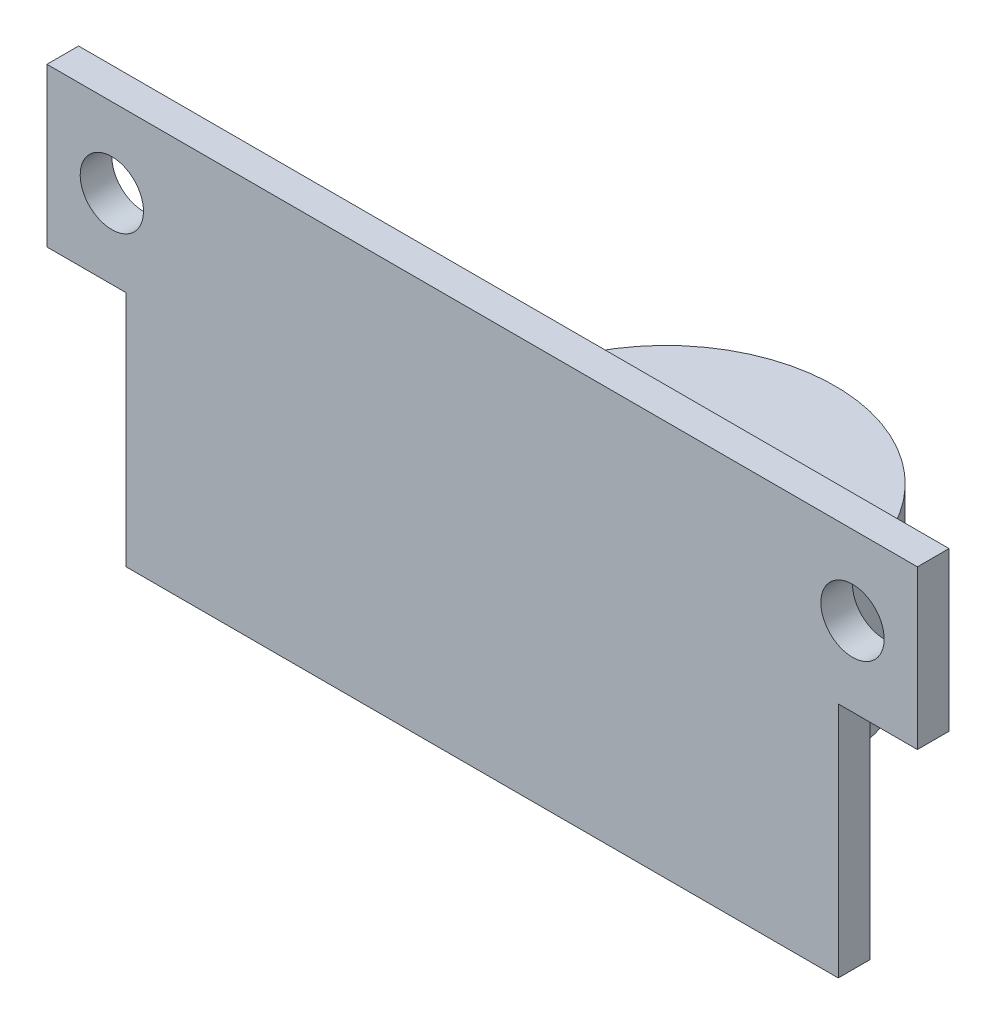
ISO-10303-21;
HEADER;
FILE_DESCRIPTION(('STEP AP214'),'2;1');
FILE_NAME('part.step','',(''),(''),'','','');
FILE_SCHEMA(('AUTOMOTIVE_DESIGN { 1 0 10303 214 1 1 1 1 }'));
ENDSEC;
DATA;
#1=APPLICATION_CONTEXT('core data for automotive mechanical design processes');
#2=APPLICATION_PROTOCOL_DEFINITION('international standard','automotive_design',2000,#1);
#3=PRODUCT_CONTEXT('',#1,'mechanical');
#4=PRODUCT('Part','Part','',(#3));
#5=PRODUCT_RELATED_PRODUCT_CATEGORY('part','',(#4));
#6=PRODUCT_DEFINITION_FORMATION('','',#4);
#7=PRODUCT_DEFINITION_CONTEXT('part definition',#1,'design');
#8=PRODUCT_DEFINITION('design','',#6,#7);
#9=PRODUCT_DEFINITION_SHAPE('','',#8);
#10=(LENGTH_UNIT() NAMED_UNIT(*) SI_UNIT(.MILLI.,.METRE.));
#11=(NAMED_UNIT(*) PLANE_ANGLE_UNIT() SI_UNIT($,.RADIAN.));
#12=(NAMED_UNIT(*) SI_UNIT($,.STERADIAN.) SOLID_ANGLE_UNIT());
#13=UNCERTAINTY_MEASURE_WITH_UNIT(LENGTH_MEASURE(1.E-05),#10,'distance_accuracy_value','');
#14=(GEOMETRIC_REPRESENTATION_CONTEXT(3) GLOBAL_UNCERTAINTY_ASSIGNED_CONTEXT((#13)) GLOBAL_UNIT_ASSIGNED_CONTEXT((#10,
#11,#12)) REPRESENTATION_CONTEXT('',''));
#15=CARTESIAN_POINT('',(0.,0.,0.));
#16=DIRECTION('',(0.,0.,1.));
#17=DIRECTION('',(1.,0.,0.));
#18=AXIS2_PLACEMENT_3D('',#15,#16,#17);
#19=CARTESIAN_POINT('',(0.,0.,3.99999999999998));
#20=DIRECTION('',(0.,0.,-1.));
#21=DIRECTION('',(0.,1.,0.));
#22=AXIS2_PLACEMENT_3D('',#19,#20,#21);
#23=PLANE('',#22);
#24=DIRECTION('',(0.,1.,0.));
#25=VECTOR('',#24,1.);
#26=CARTESIAN_POINT('',(4.30657205279038,0.,3.99999999999998));
#27=LINE('',#26,#25);
#28=CARTESIAN_POINT('',(4.30657205279038,-25.,3.99999999999997));
#29=VERTEX_POINT('',#28);
#30=CARTESIAN_POINT('',(4.30657205279038,-15.,3.99999999999997));
#31=VERTEX_POINT('',#30);
#32=EDGE_CURVE('E290',#29,#31,#27,.T.);
#33=ORIENTED_EDGE('',*,*,#32,.F.);
#34=DIRECTION('',(-1.,0.,0.));
#35=VECTOR('',#34,1.);
#36=CARTESIAN_POINT('',(13.9916828962797,-25.,3.99999999999997));
#37=LINE('',#36,#35);
#38=CARTESIAN_POINT('',(-7.49342794721088,-25.,3.99999999999996));
#39=VERTEX_POINT('',#38);
#40=EDGE_CURVE('E185',#29,#39,#37,.T.);
#41=ORIENTED_EDGE('',*,*,#40,.T.);
#42=DIRECTION('',(0.,-1.,0.));
#43=VECTOR('',#42,1.);
#44=CARTESIAN_POINT('',(-7.49342794721085,-132.522193308764,3.99999999999992));
#45=LINE('',#44,#43);
#46=CARTESIAN_POINT('',(-7.49342794721088,-10.,3.99999999999997));
#47=VERTEX_POINT('',#46);
#48=EDGE_CURVE('E204',#47,#39,#45,.T.);
#49=ORIENTED_EDGE('',*,*,#48,.F.);
#50=DIRECTION('',(-1.,0.,0.));
#51=VECTOR('',#50,1.);
#52=CARTESIAN_POINT('',(13.9916828962796,-9.99999999999999,3.99999999999997));
#53=LINE('',#52,#51);
#54=CARTESIAN_POINT('',(-12.493427947211,-10.,3.99999999999997));
#55=VERTEX_POINT('',#54);
#56=EDGE_CURVE('E229',#47,#55,#53,.T.);
#57=ORIENTED_EDGE('',*,*,#56,.T.);
#58=DIRECTION('',(0.,1.,0.));
#59=VECTOR('',#58,1.);
#60=CARTESIAN_POINT('',(-12.4934279472109,-132.522193308764,3.99999999999992));
#61=LINE('',#60,#59);
#62=CARTESIAN_POINT('',(-12.493427947211,0.,3.99999999999997));
#63=VERTEX_POINT('',#62);
#64=EDGE_CURVE('E153',#55,#63,#61,.T.);
#65=ORIENTED_EDGE('',*,*,#64,.T.);
#66=DIRECTION('',(-1.,0.,0.));
#67=VECTOR('',#66,1.);
#68=CARTESIAN_POINT('',(13.9916828962797,0.,3.99999999999998));
#69=LINE('',#68,#67);
#70=CARTESIAN_POINT('',(42.5065720527891,0.,3.99999999999998));
#71=VERTEX_POINT('',#70);
#72=EDGE_CURVE('E260',#71,#63,#69,.T.);
#73=ORIENTED_EDGE('',*,*,#72,.F.);
#74=DIRECTION('',(0.,1.,0.));
#75=VECTOR('',#74,1.);
#76=CARTESIAN_POINT('',(42.5065720527891,-132.522193308764,3.99999999999993));
#77=LINE('',#76,#75);
#78=CARTESIAN_POINT('',(42.5065720527891,-9.99999999999997,3.99999999999998));
#79=VERTEX_POINT('',#78);
#80=EDGE_CURVE('E255',#79,#71,#77,.T.);
#81=ORIENTED_EDGE('',*,*,#80,.F.);
#82=DIRECTION('',(-1.,0.,0.));
#83=VECTOR('',#82,1.);
#84=CARTESIAN_POINT('',(13.9916828962796,-9.99999999999999,3.99999999999997));
#85=LINE('',#84,#83);
#86=CARTESIAN_POINT('',(37.5065720527891,-9.99999999999998,3.99999999999998));
#87=VERTEX_POINT('',#86);
#88=EDGE_CURVE('E181',#79,#87,#85,.T.);
#89=ORIENTED_EDGE('',*,*,#88,.T.);
#90=DIRECTION('',(0.,-1.,0.));
#91=VECTOR('',#90,1.);
#92=CARTESIAN_POINT('',(37.5065720527891,-132.522193308764,3.99999999999992));
#93=LINE('',#92,#91);
#94=CARTESIAN_POINT('',(37.5065720527891,-25.,3.99999999999997));
#95=VERTEX_POINT('',#94);
#96=EDGE_CURVE('E171',#87,#95,#93,.T.);
#97=ORIENTED_EDGE('',*,*,#96,.T.);
#98=CARTESIAN_POINT('',(25.7065720527904,-25.,3.99999999999997));
#99=VERTEX_POINT('',#98);
#100=EDGE_CURVE('E178',#95,#99,#37,.T.);
#101=ORIENTED_EDGE('',*,*,#100,.T.);
#102=DIRECTION('',(0.,1.,0.));
#103=VECTOR('',#102,1.);
#104=CARTESIAN_POINT('',(25.7065720527904,0.,3.99999999999998));
#105=LINE('',#104,#103);
#106=CARTESIAN_POINT('',(25.7065720527904,-15.,3.99999999999997));
#107=VERTEX_POINT('',#106);
#108=EDGE_CURVE('E286',#99,#107,#105,.T.);
#109=ORIENTED_EDGE('',*,*,#108,.T.);
#110=DIRECTION('',(1.,0.,0.));
#111=VECTOR('',#110,1.);
#112=CARTESIAN_POINT('',(0.,-15.,3.99999999999997));
#113=LINE('',#112,#111);
#114=EDGE_CURVE('E12',#31,#107,#113,.T.);
#115=ORIENTED_EDGE('',*,*,#114,.F.);
#116=EDGE_LOOP('',(#33,#41,#49,#57,#65,#73,#81,#89,#97,#101,#109,#115));
#117=FACE_BOUND('',#116,.T.);
#118=CARTESIAN_POINT('',(-8.39342794721091,-5.00000000000002,3.99999999999997));
#119=DIRECTION('',(0.,0.,-1.));
#120=DIRECTION('',(0.,1.,0.));
#121=AXIS2_PLACEMENT_3D('',#118,#119,#120);
#122=CIRCLE('',#121,2.);
#123=CARTESIAN_POINT('',(-8.39342794721091,-3.00000000000002,3.99999999999997));
#124=VERTEX_POINT('',#123);
#125=EDGE_CURVE('E212',#124,#124,#122,.T.);
#126=ORIENTED_EDGE('',*,*,#125,.F.);
#127=EDGE_LOOP('',(#126));
#128=FACE_BOUND('',#127,.T.);
#129=CARTESIAN_POINT('',(38.4065720527891,-4.99999999999998,3.99999999999998));
#130=DIRECTION('',(0.,0.,-1.));
#131=DIRECTION('',(0.,1.,0.));
#132=AXIS2_PLACEMENT_3D('',#129,#130,#131);
#133=CIRCLE('',#132,2.);
#134=CARTESIAN_POINT('',(38.4065720527891,-2.99999999999997,3.99999999999998));
#135=VERTEX_POINT('',#134);
#136=EDGE_CURVE('E269',#135,#135,#133,.T.);
#137=ORIENTED_EDGE('',*,*,#136,.F.);
#138=EDGE_LOOP('',(#137));
#139=FACE_BOUND('',#138,.T.);
#140=ADVANCED_FACE('F90',(#117,#128,#139),#23,.T.);
#141=CARTESIAN_POINT('',(15.0065720527904,-15.,-5.59999999999929));
#142=DIRECTION('',(0.,-1.,0.));
#143=DIRECTION('',(0.,0.,-1.));
#144=AXIS2_PLACEMENT_3D('',#141,#142,#143);
#145=CYLINDRICAL_SURFACE('',#144,10.7);
#146=CARTESIAN_POINT('',(15.0065720527904,-15.,-5.59999999999929));
#147=DIRECTION('',(0.,1.,0.));
#148=DIRECTION('',(0.,0.,1.));
#149=AXIS2_PLACEMENT_3D('',#146,#147,#148);
#150=CIRCLE('',#149,10.7);
#151=CARTESIAN_POINT('',(25.7065720527904,-15.,-5.59999999999933));
#152=VERTEX_POINT('',#151);
#153=CARTESIAN_POINT('',(4.30657205279038,-15.,-5.59999999999922));
#154=VERTEX_POINT('',#153);
#155=EDGE_CURVE('E275',#152,#154,#150,.T.);
#156=ORIENTED_EDGE('',*,*,#155,.F.);
#157=DIRECTION('',(0.,1.,0.));
#158=VECTOR('',#157,1.);
#159=CARTESIAN_POINT('',(25.7065720527904,-25.,-5.59999999999933));
#160=LINE('',#159,#158);
#161=CARTESIAN_POINT('',(25.7065720527904,-25.,-5.59999999999933));
#162=VERTEX_POINT('',#161);
#163=EDGE_CURVE('E293',#162,#152,#160,.T.);
#164=ORIENTED_EDGE('',*,*,#163,.F.);
#165=CARTESIAN_POINT('',(15.0065720527904,-25.,-5.59999999999929));
#166=DIRECTION('',(0.,1.,0.));
#167=DIRECTION('',(0.,0.,1.));
#168=AXIS2_PLACEMENT_3D('',#165,#166,#167);
#169=CIRCLE('',#168,10.7);
#170=CARTESIAN_POINT('',(4.30657205279038,-25.,-5.59999999999922));
#171=VERTEX_POINT('',#170);
#172=EDGE_CURVE('E278',#162,#171,#169,.T.);
#173=ORIENTED_EDGE('',*,*,#172,.T.);
#174=DIRECTION('',(0.,1.,0.));
#175=VECTOR('',#174,1.);
#176=CARTESIAN_POINT('',(4.30657205279038,-25.,-5.59999999999922));
#177=LINE('',#176,#175);
#178=EDGE_CURVE('E294',#171,#154,#177,.T.);
#179=ORIENTED_EDGE('',*,*,#178,.T.);
#180=EDGE_LOOP('',(#156,#164,#173,#179));
#181=FACE_BOUND('',#180,.T.);
#182=ADVANCED_FACE('F323',(#181),#145,.T.);
#183=CARTESIAN_POINT('',(0.,0.,5.99999999999998));
#184=DIRECTION('',(0.,0.,-1.));
#185=DIRECTION('',(0.,1.,0.));
#186=AXIS2_PLACEMENT_3D('',#183,#184,#185);
#187=PLANE('',#186);
#188=DIRECTION('',(0.,-1.,0.));
#189=VECTOR('',#188,1.);
#190=CARTESIAN_POINT('',(-7.49342794721085,-132.522193308764,5.99999999999992));
#191=LINE('',#190,#189);
#192=CARTESIAN_POINT('',(-7.49342794721088,-10.,5.99999999999997));
#193=VERTEX_POINT('',#192);
#194=CARTESIAN_POINT('',(-7.49342794721088,-25.,5.99999999999996));
#195=VERTEX_POINT('',#194);
#196=EDGE_CURVE('E226',#193,#195,#191,.T.);
#197=ORIENTED_EDGE('',*,*,#196,.T.);
#198=DIRECTION('',(-1.,0.,0.));
#199=VECTOR('',#198,1.);
#200=CARTESIAN_POINT('',(13.9916828962797,-25.,5.99999999999997));
#201=LINE('',#200,#199);
#202=CARTESIAN_POINT('',(37.5065720527891,-25.,5.99999999999997));
#203=VERTEX_POINT('',#202);
#204=EDGE_CURVE('E224',#203,#195,#201,.T.);
#205=ORIENTED_EDGE('',*,*,#204,.F.);
#206=DIRECTION('',(0.,-1.,0.));
#207=VECTOR('',#206,1.);
#208=CARTESIAN_POINT('',(37.5065720527891,-132.522193308764,5.99999999999992));
#209=LINE('',#208,#207);
#210=CARTESIAN_POINT('',(37.5065720527891,-9.99999999999998,5.99999999999998));
#211=VERTEX_POINT('',#210);
#212=EDGE_CURVE('E191',#211,#203,#209,.T.);
#213=ORIENTED_EDGE('',*,*,#212,.F.);
#214=DIRECTION('',(-1.,0.,0.));
#215=VECTOR('',#214,1.);
#216=CARTESIAN_POINT('',(13.9916828962796,-9.99999999999999,5.99999999999997));
#217=LINE('',#216,#215);
#218=CARTESIAN_POINT('',(42.5065720527891,-9.99999999999997,5.99999999999998));
#219=VERTEX_POINT('',#218);
#220=EDGE_CURVE('E221',#219,#211,#217,.T.);
#221=ORIENTED_EDGE('',*,*,#220,.F.);
#222=DIRECTION('',(0.,1.,0.));
#223=VECTOR('',#222,1.);
#224=CARTESIAN_POINT('',(42.5065720527891,-132.522193308764,5.99999999999993));
#225=LINE('',#224,#223);
#226=CARTESIAN_POINT('',(42.5065720527891,0.,5.99999999999998));
#227=VERTEX_POINT('',#226);
#228=EDGE_CURVE('E218',#219,#227,#225,.T.);
#229=ORIENTED_EDGE('',*,*,#228,.T.);
#230=DIRECTION('',(-1.,0.,0.));
#231=VECTOR('',#230,1.);
#232=CARTESIAN_POINT('',(13.9916828962797,0.,5.99999999999998));
#233=LINE('',#232,#231);
#234=CARTESIAN_POINT('',(-12.493427947211,0.,5.99999999999997));
#235=VERTEX_POINT('',#234);
#236=EDGE_CURVE('E215',#227,#235,#233,.T.);
#237=ORIENTED_EDGE('',*,*,#236,.T.);
#238=DIRECTION('',(0.,1.,0.));
#239=VECTOR('',#238,1.);
#240=CARTESIAN_POINT('',(-12.4934279472109,-132.522193308764,5.99999999999992));
#241=LINE('',#240,#239);
#242=CARTESIAN_POINT('',(-12.493427947211,-10.,5.99999999999997));
#243=VERTEX_POINT('',#242);
#244=EDGE_CURVE('E211',#243,#235,#241,.T.);
#245=ORIENTED_EDGE('',*,*,#244,.F.);
#246=DIRECTION('',(-1.,0.,0.));
#247=VECTOR('',#246,1.);
#248=CARTESIAN_POINT('',(13.9916828962796,-9.99999999999999,5.99999999999997));
#249=LINE('',#248,#247);
#250=EDGE_CURVE('E209',#193,#243,#249,.T.);
#251=ORIENTED_EDGE('',*,*,#250,.F.);
#252=EDGE_LOOP('',(#197,#205,#213,#221,#229,#237,#245,#251));
#253=FACE_BOUND('',#252,.T.);
#254=CARTESIAN_POINT('',(38.4065720527891,-4.99999999999998,5.99999999999998));
#255=DIRECTION('',(0.,0.,-1.));
#256=DIRECTION('',(0.,1.,0.));
#257=AXIS2_PLACEMENT_3D('',#254,#255,#256);
#258=CIRCLE('',#257,2.);
#259=CARTESIAN_POINT('',(38.4065720527891,-2.99999999999997,5.99999999999998));
#260=VERTEX_POINT('',#259);
#261=EDGE_CURVE('E272',#260,#260,#258,.T.);
#262=ORIENTED_EDGE('',*,*,#261,.T.);
#263=EDGE_LOOP('',(#262));
#264=FACE_BOUND('',#263,.T.);
#265=CARTESIAN_POINT('',(-8.39342794721091,-5.00000000000002,5.99999999999997));
#266=DIRECTION('',(0.,0.,-1.));
#267=DIRECTION('',(0.,1.,0.));
#268=AXIS2_PLACEMENT_3D('',#265,#266,#267);
#269=CIRCLE('',#268,2.);
#270=CARTESIAN_POINT('',(-8.39342794721091,-3.00000000000002,5.99999999999997));
#271=VERTEX_POINT('',#270);
#272=EDGE_CURVE('E266',#271,#271,#269,.T.);
#273=ORIENTED_EDGE('',*,*,#272,.T.);
#274=EDGE_LOOP('',(#273));
#275=FACE_BOUND('',#274,.T.);
#276=ADVANCED_FACE('F242',(#253,#264,#275),#187,.F.);
#277=CARTESIAN_POINT('',(13.9916828962796,-9.99999999999999,3.99999999999997));
#278=DIRECTION('',(0.,1.,0.));
#279=DIRECTION('',(-1.,0.,0.));
#280=AXIS2_PLACEMENT_3D('',#277,#278,#279);
#281=PLANE('',#280);
#282=ORIENTED_EDGE('',*,*,#250,.T.);
#283=DIRECTION('',(0.,0.,1.));
#284=VECTOR('',#283,1.);
#285=CARTESIAN_POINT('',(-12.493427947211,-10.,3.99999999999997));
#286=LINE('',#285,#284);
#287=EDGE_CURVE('E98',#55,#243,#286,.T.);
#288=ORIENTED_EDGE('',*,*,#287,.F.);
#289=ORIENTED_EDGE('',*,*,#56,.F.);
#290=DIRECTION('',(0.,0.,1.));
#291=VECTOR('',#290,1.);
#292=CARTESIAN_POINT('',(-7.49342794721088,-10.,3.99999999999997));
#293=LINE('',#292,#291);
#294=EDGE_CURVE('E113',#47,#193,#293,.T.);
#295=ORIENTED_EDGE('',*,*,#294,.T.);
#296=EDGE_LOOP('',(#282,#288,#289,#295));
#297=FACE_BOUND('',#296,.T.);
#298=ADVANCED_FACE('F92',(#297),#281,.F.);
#299=CARTESIAN_POINT('',(-12.4934279472109,-132.522193308764,3.99999999999992));
#300=DIRECTION('',(1.,0.,0.));
#301=DIRECTION('',(0.,1.,0.));
#302=AXIS2_PLACEMENT_3D('',#299,#300,#301);
#303=PLANE('',#302);
#304=ORIENTED_EDGE('',*,*,#244,.T.);
#305=DIRECTION('',(0.,0.,1.));
#306=VECTOR('',#305,1.);
#307=CARTESIAN_POINT('',(-12.493427947211,0.,3.99999999999997));
#308=LINE('',#307,#306);
#309=EDGE_CURVE('E238',#63,#235,#308,.T.);
#310=ORIENTED_EDGE('',*,*,#309,.F.);
#311=ORIENTED_EDGE('',*,*,#64,.F.);
#312=ORIENTED_EDGE('',*,*,#287,.T.);
#313=EDGE_LOOP('',(#304,#310,#311,#312));
#314=FACE_BOUND('',#313,.T.);
#315=ADVANCED_FACE('F240',(#314),#303,.F.);
#316=CARTESIAN_POINT('',(13.9916828962797,0.,3.99999999999998));
#317=DIRECTION('',(0.,1.,0.));
#318=DIRECTION('',(-1.,0.,0.));
#319=AXIS2_PLACEMENT_3D('',#316,#317,#318);
#320=PLANE('',#319);
#321=ORIENTED_EDGE('',*,*,#236,.F.);
#322=DIRECTION('',(0.,0.,1.));
#323=VECTOR('',#322,1.);
#324=CARTESIAN_POINT('',(42.5065720527891,0.,3.99999999999998));
#325=LINE('',#324,#323);
#326=EDGE_CURVE('E236',#71,#227,#325,.T.);
#327=ORIENTED_EDGE('',*,*,#326,.F.);
#328=ORIENTED_EDGE('',*,*,#72,.T.);
#329=ORIENTED_EDGE('',*,*,#309,.T.);
#330=EDGE_LOOP('',(#321,#327,#328,#329));
#331=FACE_BOUND('',#330,.T.);
#332=ADVANCED_FACE('F259',(#331),#320,.T.);
#333=CARTESIAN_POINT('',(42.5065720527891,-132.522193308764,3.99999999999993));
#334=DIRECTION('',(1.,0.,0.));
#335=DIRECTION('',(0.,0.,-1.));
#336=AXIS2_PLACEMENT_3D('',#333,#334,#335);
#337=PLANE('',#336);
#338=ORIENTED_EDGE('',*,*,#228,.F.);
#339=DIRECTION('',(0.,0.,1.));
#340=VECTOR('',#339,1.);
#341=CARTESIAN_POINT('',(42.5065720527891,-9.99999999999997,3.99999999999998));
#342=LINE('',#341,#340);
#343=EDGE_CURVE('E234',#79,#219,#342,.T.);
#344=ORIENTED_EDGE('',*,*,#343,.F.);
#345=ORIENTED_EDGE('',*,*,#80,.T.);
#346=ORIENTED_EDGE('',*,*,#326,.T.);
#347=EDGE_LOOP('',(#338,#344,#345,#346));
#348=FACE_BOUND('',#347,.T.);
#349=ADVANCED_FACE('F252',(#348),#337,.T.);
#350=CARTESIAN_POINT('',(13.9916828962796,-9.99999999999999,3.99999999999997));
#351=DIRECTION('',(0.,1.,0.));
#352=DIRECTION('',(-1.,0.,0.));
#353=AXIS2_PLACEMENT_3D('',#350,#351,#352);
#354=PLANE('',#353);
#355=ORIENTED_EDGE('',*,*,#220,.T.);
#356=DIRECTION('',(0.,0.,1.));
#357=VECTOR('',#356,1.);
#358=CARTESIAN_POINT('',(37.5065720527891,-9.99999999999998,3.99999999999998));
#359=LINE('',#358,#357);
#360=EDGE_CURVE('E194',#87,#211,#359,.T.);
#361=ORIENTED_EDGE('',*,*,#360,.F.);
#362=ORIENTED_EDGE('',*,*,#88,.F.);
#363=ORIENTED_EDGE('',*,*,#343,.T.);
#364=EDGE_LOOP('',(#355,#361,#362,#363));
#365=FACE_BOUND('',#364,.T.);
#366=ADVANCED_FACE('F353',(#365),#354,.F.);
#367=CARTESIAN_POINT('',(37.5065720527891,-132.522193308764,3.99999999999992));
#368=DIRECTION('',(-1.,0.,0.));
#369=DIRECTION('',(0.,0.,1.));
#370=AXIS2_PLACEMENT_3D('',#367,#368,#369);
#371=PLANE('',#370);
#372=ORIENTED_EDGE('',*,*,#212,.T.);
#373=DIRECTION('',(0.,0.,1.));
#374=VECTOR('',#373,1.);
#375=CARTESIAN_POINT('',(37.5065720527891,-25.,3.99999999999997));
#376=LINE('',#375,#374);
#377=EDGE_CURVE('E188',#95,#203,#376,.T.);
#378=ORIENTED_EDGE('',*,*,#377,.F.);
#379=ORIENTED_EDGE('',*,*,#96,.F.);
#380=ORIENTED_EDGE('',*,*,#360,.T.);
#381=EDGE_LOOP('',(#372,#378,#379,#380));
#382=FACE_BOUND('',#381,.T.);
#383=ADVANCED_FACE('F189',(#382),#371,.F.);
#384=CARTESIAN_POINT('',(13.9916828962797,-25.,3.99999999999997));
#385=DIRECTION('',(0.,1.,0.));
#386=DIRECTION('',(0.,0.,1.));
#387=AXIS2_PLACEMENT_3D('',#384,#385,#386);
#388=PLANE('',#387);
#389=ORIENTED_EDGE('',*,*,#40,.F.);
#390=DIRECTION('',(0.,0.,1.));
#391=VECTOR('',#390,1.);
#392=CARTESIAN_POINT('',(4.30657205279038,-25.,0.));
#393=LINE('',#392,#391);
#394=EDGE_CURVE('E299',#171,#29,#393,.T.);
#395=ORIENTED_EDGE('',*,*,#394,.F.);
#396=ORIENTED_EDGE('',*,*,#172,.F.);
#397=DIRECTION('',(0.,0.,1.));
#398=VECTOR('',#397,1.);
#399=CARTESIAN_POINT('',(25.7065720527904,-25.,0.));
#400=LINE('',#399,#398);
#401=EDGE_CURVE('E203',#162,#99,#400,.T.);
#402=ORIENTED_EDGE('',*,*,#401,.T.);
#403=ORIENTED_EDGE('',*,*,#100,.F.);
#404=ORIENTED_EDGE('',*,*,#377,.T.);
#405=ORIENTED_EDGE('',*,*,#204,.T.);
#406=DIRECTION('',(0.,0.,1.));
#407=VECTOR('',#406,1.);
#408=CARTESIAN_POINT('',(-7.49342794721088,-25.,3.99999999999996));
#409=LINE('',#408,#407);
#410=EDGE_CURVE('E195',#39,#195,#409,.T.);
#411=ORIENTED_EDGE('',*,*,#410,.F.);
#412=EDGE_LOOP('',(#389,#395,#396,#402,#403,#404,#405,#411));
#413=FACE_BOUND('',#412,.T.);
#414=CARTESIAN_POINT('',(15.0065720527904,-25.,-5.59999999999929));
#415=DIRECTION('',(0.,1.,0.));
#416=DIRECTION('',(0.,0.,1.));
#417=AXIS2_PLACEMENT_3D('',#414,#415,#416);
#418=CIRCLE('',#417,4.1);
#419=CARTESIAN_POINT('',(15.0065720527904,-25.,-1.49999999999929));
#420=VERTEX_POINT('',#419);
#421=EDGE_CURVE('E283',#420,#420,#418,.T.);
#422=ORIENTED_EDGE('',*,*,#421,.T.);
#423=EDGE_LOOP('',(#422));
#424=FACE_BOUND('',#423,.T.);
#425=ADVANCED_FACE('F199',(#413,#424),#388,.F.);
#426=CARTESIAN_POINT('',(-7.49342794721085,-132.522193308764,3.99999999999992));
#427=DIRECTION('',(-1.,0.,0.));
#428=DIRECTION('',(0.,-1.,0.));
#429=AXIS2_PLACEMENT_3D('',#426,#427,#428);
#430=PLANE('',#429);
#431=ORIENTED_EDGE('',*,*,#196,.F.);
#432=ORIENTED_EDGE('',*,*,#294,.F.);
#433=ORIENTED_EDGE('',*,*,#48,.T.);
#434=ORIENTED_EDGE('',*,*,#410,.T.);
#435=EDGE_LOOP('',(#431,#432,#433,#434));
#436=FACE_BOUND('',#435,.T.);
#437=ADVANCED_FACE('F244',(#436),#430,.T.);
#438=CARTESIAN_POINT('',(-8.39342794721091,-5.00000000000002,3.99999999999997));
#439=DIRECTION('',(0.,0.,1.));
#440=DIRECTION('',(1.,0.,0.));
#441=AXIS2_PLACEMENT_3D('',#438,#439,#440);
#442=CYLINDRICAL_SURFACE('',#441,2.);
#443=ORIENTED_EDGE('',*,*,#125,.T.);
#444=EDGE_LOOP('',(#443));
#445=FACE_BOUND('',#444,.T.);
#446=ORIENTED_EDGE('',*,*,#272,.F.);
#447=EDGE_LOOP('',(#446));
#448=FACE_BOUND('',#447,.T.);
#449=ADVANCED_FACE('F342',(#445,#448),#442,.F.);
#450=CARTESIAN_POINT('',(38.4065720527891,-4.99999999999998,3.99999999999998));
#451=DIRECTION('',(0.,0.,1.));
#452=DIRECTION('',(1.,0.,0.));
#453=AXIS2_PLACEMENT_3D('',#450,#451,#452);
#454=CYLINDRICAL_SURFACE('',#453,2.);
#455=ORIENTED_EDGE('',*,*,#136,.T.);
#456=EDGE_LOOP('',(#455));
#457=FACE_BOUND('',#456,.T.);
#458=ORIENTED_EDGE('',*,*,#261,.F.);
#459=EDGE_LOOP('',(#458));
#460=FACE_BOUND('',#459,.T.);
#461=ADVANCED_FACE('F339',(#457,#460),#454,.F.);
#462=CARTESIAN_POINT('',(15.0065720527904,-15.,-5.59999999999929));
#463=DIRECTION('',(0.,1.,0.));
#464=DIRECTION('',(0.,0.,1.));
#465=AXIS2_PLACEMENT_3D('',#462,#463,#464);
#466=PLANE('',#465);
#467=CARTESIAN_POINT('',(15.0065720527904,-15.,-5.59999999999929));
#468=DIRECTION('',(0.,1.,0.));
#469=DIRECTION('',(0.,0.,1.));
#470=AXIS2_PLACEMENT_3D('',#467,#468,#469);
#471=CIRCLE('',#470,4.1);
#472=CARTESIAN_POINT('',(15.0065720527904,-15.,-1.49999999999929));
#473=VERTEX_POINT('',#472);
#474=EDGE_CURVE('E281',#473,#473,#471,.T.);
#475=ORIENTED_EDGE('',*,*,#474,.F.);
#476=EDGE_LOOP('',(#475));
#477=FACE_BOUND('',#476,.T.);
#478=ORIENTED_EDGE('',*,*,#155,.T.);
#479=DIRECTION('',(0.,0.,1.));
#480=VECTOR('',#479,1.);
#481=CARTESIAN_POINT('',(4.30657205279038,-15.,0.));
#482=LINE('',#481,#480);
#483=EDGE_CURVE('E300',#154,#31,#482,.T.);
#484=ORIENTED_EDGE('',*,*,#483,.T.);
#485=ORIENTED_EDGE('',*,*,#114,.T.);
#486=DIRECTION('',(0.,0.,1.));
#487=VECTOR('',#486,1.);
#488=CARTESIAN_POINT('',(25.7065720527904,-15.,0.));
#489=LINE('',#488,#487);
#490=EDGE_CURVE('E104',#152,#107,#489,.T.);
#491=ORIENTED_EDGE('',*,*,#490,.F.);
#492=EDGE_LOOP('',(#478,#484,#485,#491));
#493=FACE_BOUND('',#492,.T.);
#494=ADVANCED_FACE('F316',(#477,#493),#466,.T.);
#495=CARTESIAN_POINT('',(15.0065720527904,-15.,-5.59999999999929));
#496=DIRECTION('',(0.,-1.,0.));
#497=DIRECTION('',(0.,0.,-1.));
#498=AXIS2_PLACEMENT_3D('',#495,#496,#497);
#499=CYLINDRICAL_SURFACE('',#498,4.1);
#500=ORIENTED_EDGE('',*,*,#421,.F.);
#501=EDGE_LOOP('',(#500));
#502=FACE_BOUND('',#501,.T.);
#503=ORIENTED_EDGE('',*,*,#474,.T.);
#504=EDGE_LOOP('',(#503));
#505=FACE_BOUND('',#504,.T.);
#506=ADVANCED_FACE('F390',(#502,#505),#499,.F.);
#507=CARTESIAN_POINT('',(25.7065720527904,-25.,0.));
#508=DIRECTION('',(-1.,0.,0.));
#509=DIRECTION('',(0.,-1.,0.));
#510=AXIS2_PLACEMENT_3D('',#507,#508,#509);
#511=PLANE('',#510);
#512=ORIENTED_EDGE('',*,*,#108,.F.);
#513=ORIENTED_EDGE('',*,*,#401,.F.);
#514=ORIENTED_EDGE('',*,*,#163,.T.);
#515=ORIENTED_EDGE('',*,*,#490,.T.);
#516=EDGE_LOOP('',(#512,#513,#514,#515));
#517=FACE_BOUND('',#516,.T.);
#518=ADVANCED_FACE('F319',(#517),#511,.F.);
#519=CARTESIAN_POINT('',(4.30657205279038,-25.,0.));
#520=DIRECTION('',(-1.,0.,0.));
#521=DIRECTION('',(0.,0.,1.));
#522=AXIS2_PLACEMENT_3D('',#519,#520,#521);
#523=PLANE('',#522);
#524=ORIENTED_EDGE('',*,*,#394,.T.);
#525=ORIENTED_EDGE('',*,*,#32,.T.);
#526=ORIENTED_EDGE('',*,*,#483,.F.);
#527=ORIENTED_EDGE('',*,*,#178,.F.);
#528=EDGE_LOOP('',(#524,#525,#526,#527));
#529=FACE_BOUND('',#528,.T.);
#530=ADVANCED_FACE('F307',(#529),#523,.T.);
#531=CLOSED_SHELL('',(#140,#182,#276,#298,#315,#332,#349,#366,#383,#425,#437,#449,#461,#494,
#506,#518,#530));
#532=MANIFOLD_SOLID_BREP('B2',#531);
#533=ADVANCED_BREP_SHAPE_REPRESENTATION('',(#18,#532),#14);
#534=SHAPE_DEFINITION_REPRESENTATION(#9,#533);
ENDSEC;
END-ISO-10303-21;
